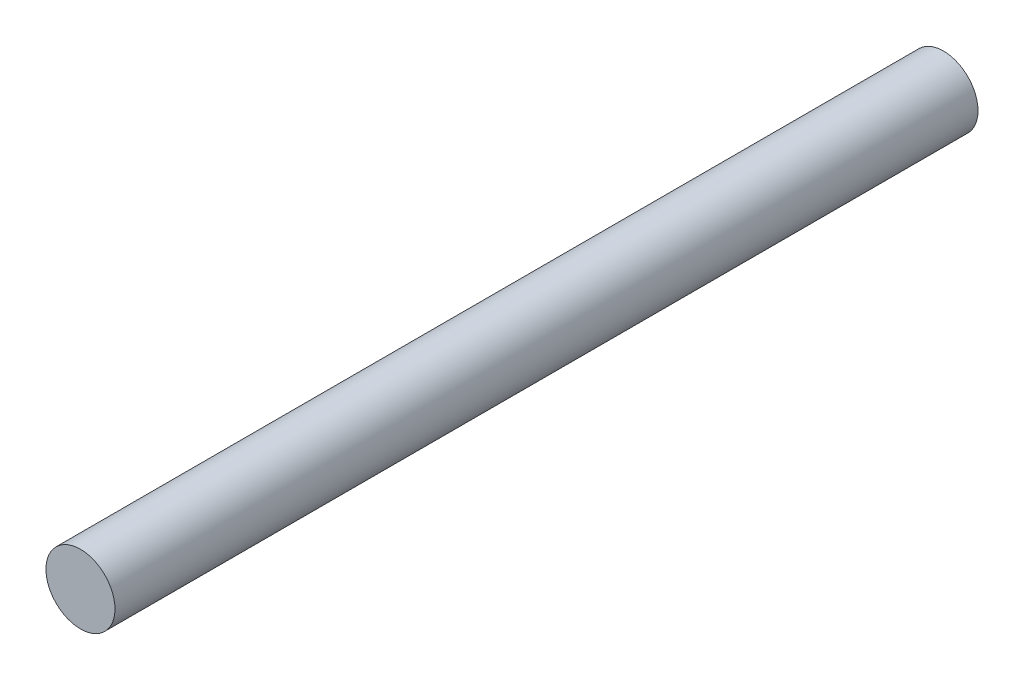
ISO-10303-21;
HEADER;
FILE_DESCRIPTION(('STEP AP214'),'2;1');
FILE_NAME('part.step','',(''),(''),'','','');
FILE_SCHEMA(('AUTOMOTIVE_DESIGN { 1 0 10303 214 1 1 1 1 }'));
ENDSEC;
DATA;
#1=APPLICATION_CONTEXT('core data for automotive mechanical design processes');
#2=APPLICATION_PROTOCOL_DEFINITION('international standard','automotive_design',2000,#1);
#3=PRODUCT_CONTEXT('',#1,'mechanical');
#4=PRODUCT('Part','Part','',(#3));
#5=PRODUCT_RELATED_PRODUCT_CATEGORY('part','',(#4));
#6=PRODUCT_DEFINITION_FORMATION('','',#4);
#7=PRODUCT_DEFINITION_CONTEXT('part definition',#1,'design');
#8=PRODUCT_DEFINITION('design','',#6,#7);
#9=PRODUCT_DEFINITION_SHAPE('','',#8);
#10=(LENGTH_UNIT() NAMED_UNIT(*) SI_UNIT(.MILLI.,.METRE.));
#11=(NAMED_UNIT(*) PLANE_ANGLE_UNIT() SI_UNIT($,.RADIAN.));
#12=(NAMED_UNIT(*) SI_UNIT($,.STERADIAN.) SOLID_ANGLE_UNIT());
#13=UNCERTAINTY_MEASURE_WITH_UNIT(LENGTH_MEASURE(1.E-05),#10,'distance_accuracy_value','');
#14=(GEOMETRIC_REPRESENTATION_CONTEXT(3) GLOBAL_UNCERTAINTY_ASSIGNED_CONTEXT((#13)) GLOBAL_UNIT_ASSIGNED_CONTEXT((#10,
#11,#12)) REPRESENTATION_CONTEXT('',''));
#15=CARTESIAN_POINT('',(0.,0.,0.));
#16=DIRECTION('',(0.,0.,1.));
#17=DIRECTION('',(1.,0.,0.));
#18=AXIS2_PLACEMENT_3D('',#15,#16,#17);
#19=CARTESIAN_POINT('',(-0.429970964660022,0.487207359306324,10.));
#20=DIRECTION('',(0.,0.,-1.));
#21=DIRECTION('',(-1.,0.,0.));
#22=AXIS2_PLACEMENT_3D('',#19,#20,#21);
#23=CYLINDRICAL_SURFACE('',#22,0.4);
#24=CARTESIAN_POINT('',(-0.429970964660022,0.487207359306324,10.));
#25=DIRECTION('',(0.,0.,1.));
#26=DIRECTION('',(1.,0.,0.));
#27=AXIS2_PLACEMENT_3D('',#24,#25,#26);
#28=CIRCLE('',#27,0.4);
#29=CARTESIAN_POINT('',(-0.0299709646600222,0.487207359306324,10.));
#30=VERTEX_POINT('',#29);
#31=EDGE_CURVE('E10',#30,#30,#28,.T.);
#32=ORIENTED_EDGE('',*,*,#31,.F.);
#33=EDGE_LOOP('',(#32));
#34=FACE_BOUND('',#33,.T.);
#35=CARTESIAN_POINT('',(-0.429970964660022,0.487207359306324,0.));
#36=DIRECTION('',(0.,0.,1.));
#37=DIRECTION('',(1.,0.,0.));
#38=AXIS2_PLACEMENT_3D('',#35,#36,#37);
#39=CIRCLE('',#38,0.4);
#40=CARTESIAN_POINT('',(-0.0299709646600222,0.487207359306324,0.));
#41=VERTEX_POINT('',#40);
#42=EDGE_CURVE('E34',#41,#41,#39,.T.);
#43=ORIENTED_EDGE('',*,*,#42,.T.);
#44=EDGE_LOOP('',(#43));
#45=FACE_BOUND('',#44,.T.);
#46=ADVANCED_FACE('F31',(#34,#45),#23,.T.);
#47=CARTESIAN_POINT('',(-0.429970964660022,0.487207359306324,10.));
#48=DIRECTION('',(0.,0.,1.));
#49=DIRECTION('',(1.,0.,0.));
#50=AXIS2_PLACEMENT_3D('',#47,#48,#49);
#51=PLANE('',#50);
#52=ORIENTED_EDGE('',*,*,#31,.T.);
#53=EDGE_LOOP('',(#52));
#54=FACE_BOUND('',#53,.T.);
#55=ADVANCED_FACE('F46',(#54),#51,.T.);
#56=CARTESIAN_POINT('',(-0.429970964660022,0.487207359306324,0.));
#57=DIRECTION('',(0.,0.,1.));
#58=DIRECTION('',(1.,0.,0.));
#59=AXIS2_PLACEMENT_3D('',#56,#57,#58);
#60=PLANE('',#59);
#61=ORIENTED_EDGE('',*,*,#42,.F.);
#62=EDGE_LOOP('',(#61));
#63=FACE_BOUND('',#62,.T.);
#64=ADVANCED_FACE('F44',(#63),#60,.F.);
#65=CLOSED_SHELL('',(#46,#55,#64));
#66=MANIFOLD_SOLID_BREP('B2',#65);
#67=ADVANCED_BREP_SHAPE_REPRESENTATION('',(#18,#66),#14);
#68=SHAPE_DEFINITION_REPRESENTATION(#9,#67);
ENDSEC;
END-ISO-10303-21;
